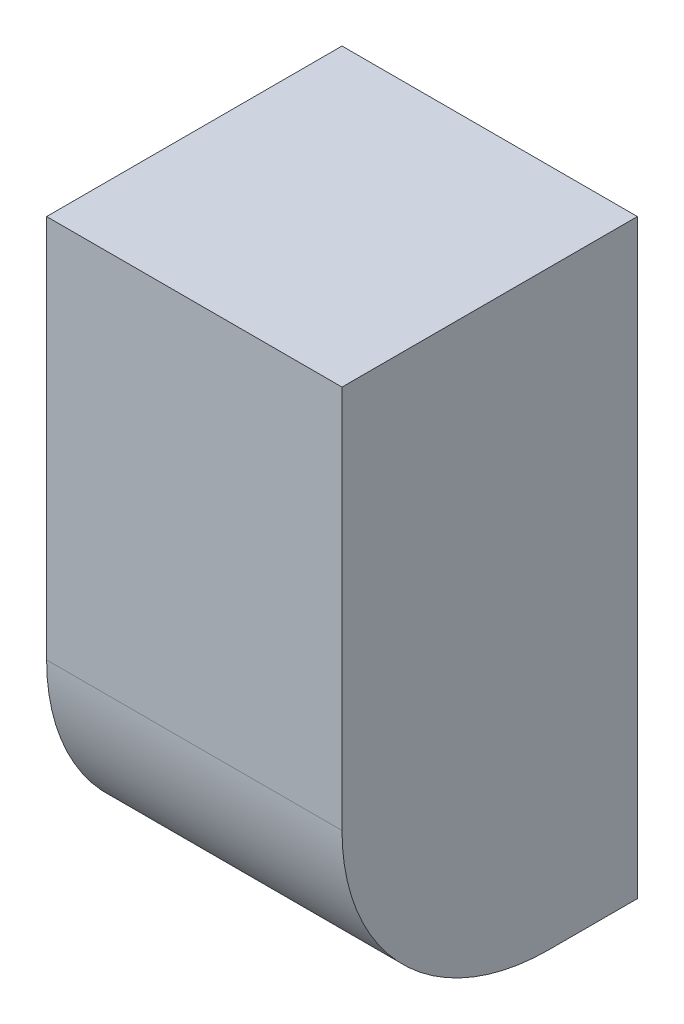
ISO-10303-21;
HEADER;
FILE_DESCRIPTION(('STEP AP214'),'2;1');
FILE_NAME('part.step','',(''),(''),'','','');
FILE_SCHEMA(('AUTOMOTIVE_DESIGN { 1 0 10303 214 1 1 1 1 }'));
ENDSEC;
DATA;
#1=APPLICATION_CONTEXT('core data for automotive mechanical design processes');
#2=APPLICATION_PROTOCOL_DEFINITION('international standard','automotive_design',2000,#1);
#3=PRODUCT_CONTEXT('',#1,'mechanical');
#4=PRODUCT('Part','Part','',(#3));
#5=PRODUCT_RELATED_PRODUCT_CATEGORY('part','',(#4));
#6=PRODUCT_DEFINITION_FORMATION('','',#4);
#7=PRODUCT_DEFINITION_CONTEXT('part definition',#1,'design');
#8=PRODUCT_DEFINITION('design','',#6,#7);
#9=PRODUCT_DEFINITION_SHAPE('','',#8);
#10=(LENGTH_UNIT() NAMED_UNIT(*) SI_UNIT(.MILLI.,.METRE.));
#11=(NAMED_UNIT(*) PLANE_ANGLE_UNIT() SI_UNIT($,.RADIAN.));
#12=(NAMED_UNIT(*) SI_UNIT($,.STERADIAN.) SOLID_ANGLE_UNIT());
#13=UNCERTAINTY_MEASURE_WITH_UNIT(LENGTH_MEASURE(1.E-05),#10,'distance_accuracy_value','');
#14=(GEOMETRIC_REPRESENTATION_CONTEXT(3) GLOBAL_UNCERTAINTY_ASSIGNED_CONTEXT((#13)) GLOBAL_UNIT_ASSIGNED_CONTEXT((#10,
#11,#12)) REPRESENTATION_CONTEXT('',''));
#15=CARTESIAN_POINT('',(0.,0.,0.));
#16=DIRECTION('',(0.,0.,1.));
#17=DIRECTION('',(1.,0.,0.));
#18=AXIS2_PLACEMENT_3D('',#15,#16,#17);
#19=CARTESIAN_POINT('',(-40.,-40.,10.));
#20=DIRECTION('',(1.,0.,0.));
#21=DIRECTION('',(0.,0.,-1.));
#22=AXIS2_PLACEMENT_3D('',#19,#20,#21);
#23=PLANE('',#22);
#24=DIRECTION('',(0.,0.,-1.));
#25=VECTOR('',#24,1.);
#26=CARTESIAN_POINT('',(-40.,-40.,10.));
#27=LINE('',#26,#25);
#28=CARTESIAN_POINT('',(-40.,-40.,3.));
#29=VERTEX_POINT('',#28);
#30=CARTESIAN_POINT('',(-40.,-40.,0.));
#31=VERTEX_POINT('',#30);
#32=EDGE_CURVE('E120',#29,#31,#27,.T.);
#33=ORIENTED_EDGE('',*,*,#32,.F.);
#34=CARTESIAN_POINT('',(-40.,-33.,3.));
#35=DIRECTION('',(1.,0.,0.));
#36=DIRECTION('',(0.,0.,-1.));
#37=AXIS2_PLACEMENT_3D('',#34,#35,#36);
#38=CIRCLE('',#37,7.);
#39=CARTESIAN_POINT('',(-40.,-33.,10.));
#40=VERTEX_POINT('',#39);
#41=EDGE_CURVE('E11',#29,#40,#38,.F.);
#42=ORIENTED_EDGE('',*,*,#41,.T.);
#43=DIRECTION('',(0.,-1.,0.));
#44=VECTOR('',#43,1.);
#45=CARTESIAN_POINT('',(-40.,-40.,10.));
#46=LINE('',#45,#44);
#47=CARTESIAN_POINT('',(-40.,-20.,10.));
#48=VERTEX_POINT('',#47);
#49=EDGE_CURVE('E91',#48,#40,#46,.T.);
#50=ORIENTED_EDGE('',*,*,#49,.F.);
#51=DIRECTION('',(0.,0.,-1.));
#52=VECTOR('',#51,1.);
#53=CARTESIAN_POINT('',(-40.,-20.,10.));
#54=LINE('',#53,#52);
#55=CARTESIAN_POINT('',(-40.,-20.,0.));
#56=VERTEX_POINT('',#55);
#57=EDGE_CURVE('E101',#48,#56,#54,.T.);
#58=ORIENTED_EDGE('',*,*,#57,.T.);
#59=DIRECTION('',(0.,-1.,0.));
#60=VECTOR('',#59,1.);
#61=CARTESIAN_POINT('',(-40.,-40.,0.));
#62=LINE('',#61,#60);
#63=EDGE_CURVE('E110',#56,#31,#62,.T.);
#64=ORIENTED_EDGE('',*,*,#63,.T.);
#65=EDGE_LOOP('',(#33,#42,#50,#58,#64));
#66=FACE_BOUND('',#65,.T.);
#67=ADVANCED_FACE('F38',(#66),#23,.F.);
#68=CARTESIAN_POINT('',(-40.,-40.,10.));
#69=DIRECTION('',(0.,1.,0.));
#70=DIRECTION('',(0.,0.,1.));
#71=AXIS2_PLACEMENT_3D('',#68,#69,#70);
#72=PLANE('',#71);
#73=DIRECTION('',(0.,0.,-1.));
#74=VECTOR('',#73,1.);
#75=CARTESIAN_POINT('',(-30.,-40.,10.));
#76=LINE('',#75,#74);
#77=CARTESIAN_POINT('',(-30.,-40.,3.));
#78=VERTEX_POINT('',#77);
#79=CARTESIAN_POINT('',(-30.,-40.,0.));
#80=VERTEX_POINT('',#79);
#81=EDGE_CURVE('E100',#78,#80,#76,.T.);
#82=ORIENTED_EDGE('',*,*,#81,.F.);
#83=DIRECTION('',(1.,0.,0.));
#84=VECTOR('',#83,1.);
#85=CARTESIAN_POINT('',(-40.,-40.,3.));
#86=LINE('',#85,#84);
#87=EDGE_CURVE('E46',#78,#29,#86,.F.);
#88=ORIENTED_EDGE('',*,*,#87,.T.);
#89=ORIENTED_EDGE('',*,*,#32,.T.);
#90=DIRECTION('',(1.,0.,0.));
#91=VECTOR('',#90,1.);
#92=CARTESIAN_POINT('',(-40.,-40.,0.));
#93=LINE('',#92,#91);
#94=EDGE_CURVE('E113',#31,#80,#93,.T.);
#95=ORIENTED_EDGE('',*,*,#94,.T.);
#96=EDGE_LOOP('',(#82,#88,#89,#95));
#97=FACE_BOUND('',#96,.T.);
#98=ADVANCED_FACE('F124',(#97),#72,.F.);
#99=CARTESIAN_POINT('',(-30.,-40.,10.));
#100=DIRECTION('',(-1.,0.,0.));
#101=DIRECTION('',(0.,0.,1.));
#102=AXIS2_PLACEMENT_3D('',#99,#100,#101);
#103=PLANE('',#102);
#104=DIRECTION('',(0.,1.,0.));
#105=VECTOR('',#104,1.);
#106=CARTESIAN_POINT('',(-30.,-40.,10.));
#107=LINE('',#106,#105);
#108=CARTESIAN_POINT('',(-30.,-33.,10.));
#109=VERTEX_POINT('',#108);
#110=CARTESIAN_POINT('',(-30.,-20.,10.));
#111=VERTEX_POINT('',#110);
#112=EDGE_CURVE('E82',#109,#111,#107,.T.);
#113=ORIENTED_EDGE('',*,*,#112,.F.);
#114=CARTESIAN_POINT('',(-30.,-33.,3.));
#115=DIRECTION('',(-1.,0.,0.));
#116=DIRECTION('',(0.,0.,1.));
#117=AXIS2_PLACEMENT_3D('',#114,#115,#116);
#118=CIRCLE('',#117,7.);
#119=EDGE_CURVE('E60',#109,#78,#118,.F.);
#120=ORIENTED_EDGE('',*,*,#119,.T.);
#121=ORIENTED_EDGE('',*,*,#81,.T.);
#122=DIRECTION('',(0.,1.,0.));
#123=VECTOR('',#122,1.);
#124=CARTESIAN_POINT('',(-30.,-40.,0.));
#125=LINE('',#124,#123);
#126=CARTESIAN_POINT('',(-30.,-20.,0.));
#127=VERTEX_POINT('',#126);
#128=EDGE_CURVE('E97',#80,#127,#125,.T.);
#129=ORIENTED_EDGE('',*,*,#128,.T.);
#130=DIRECTION('',(0.,0.,-1.));
#131=VECTOR('',#130,1.);
#132=CARTESIAN_POINT('',(-30.,-20.,10.));
#133=LINE('',#132,#131);
#134=EDGE_CURVE('E94',#111,#127,#133,.T.);
#135=ORIENTED_EDGE('',*,*,#134,.F.);
#136=EDGE_LOOP('',(#113,#120,#121,#129,#135));
#137=FACE_BOUND('',#136,.T.);
#138=ADVANCED_FACE('F95',(#137),#103,.F.);
#139=CARTESIAN_POINT('',(-40.,-20.,10.));
#140=DIRECTION('',(0.,-1.,0.));
#141=DIRECTION('',(0.,0.,-1.));
#142=AXIS2_PLACEMENT_3D('',#139,#140,#141);
#143=PLANE('',#142);
#144=DIRECTION('',(-1.,0.,0.));
#145=VECTOR('',#144,1.);
#146=CARTESIAN_POINT('',(-40.,-20.,0.));
#147=LINE('',#146,#145);
#148=EDGE_CURVE('E117',#127,#56,#147,.T.);
#149=ORIENTED_EDGE('',*,*,#148,.T.);
#150=ORIENTED_EDGE('',*,*,#57,.F.);
#151=DIRECTION('',(-1.,0.,0.));
#152=VECTOR('',#151,1.);
#153=CARTESIAN_POINT('',(-40.,-20.,10.));
#154=LINE('',#153,#152);
#155=EDGE_CURVE('E87',#111,#48,#154,.T.);
#156=ORIENTED_EDGE('',*,*,#155,.F.);
#157=ORIENTED_EDGE('',*,*,#134,.T.);
#158=EDGE_LOOP('',(#149,#150,#156,#157));
#159=FACE_BOUND('',#158,.T.);
#160=ADVANCED_FACE('F103',(#159),#143,.F.);
#161=CARTESIAN_POINT('',(0.,0.,10.));
#162=DIRECTION('',(0.,0.,-1.));
#163=DIRECTION('',(-1.,0.,0.));
#164=AXIS2_PLACEMENT_3D('',#161,#162,#163);
#165=PLANE('',#164);
#166=ORIENTED_EDGE('',*,*,#49,.T.);
#167=DIRECTION('',(1.,0.,0.));
#168=VECTOR('',#167,1.);
#169=CARTESIAN_POINT('',(0.,-33.,10.));
#170=LINE('',#169,#168);
#171=EDGE_CURVE('E90',#40,#109,#170,.T.);
#172=ORIENTED_EDGE('',*,*,#171,.T.);
#173=ORIENTED_EDGE('',*,*,#112,.T.);
#174=ORIENTED_EDGE('',*,*,#155,.T.);
#175=EDGE_LOOP('',(#166,#172,#173,#174));
#176=FACE_BOUND('',#175,.T.);
#177=ADVANCED_FACE('F85',(#176),#165,.F.);
#178=CARTESIAN_POINT('',(0.,0.,0.));
#179=DIRECTION('',(0.,0.,-1.));
#180=DIRECTION('',(-1.,0.,0.));
#181=AXIS2_PLACEMENT_3D('',#178,#179,#180);
#182=PLANE('',#181);
#183=ORIENTED_EDGE('',*,*,#63,.F.);
#184=ORIENTED_EDGE('',*,*,#148,.F.);
#185=ORIENTED_EDGE('',*,*,#128,.F.);
#186=ORIENTED_EDGE('',*,*,#94,.F.);
#187=EDGE_LOOP('',(#183,#184,#185,#186));
#188=FACE_BOUND('',#187,.T.);
#189=ADVANCED_FACE('F129',(#188),#182,.T.);
#190=CARTESIAN_POINT('',(0.,-33.,3.));
#191=DIRECTION('',(1.,0.,0.));
#192=DIRECTION('',(0.,0.,-1.));
#193=AXIS2_PLACEMENT_3D('',#190,#191,#192);
#194=CYLINDRICAL_SURFACE('',#193,7.);
#195=ORIENTED_EDGE('',*,*,#41,.F.);
#196=ORIENTED_EDGE('',*,*,#87,.F.);
#197=ORIENTED_EDGE('',*,*,#119,.F.);
#198=ORIENTED_EDGE('',*,*,#171,.F.);
#199=EDGE_LOOP('',(#195,#196,#197,#198));
#200=FACE_BOUND('',#199,.T.);
#201=ADVANCED_FACE('F40',(#200),#194,.T.);
#202=CLOSED_SHELL('',(#67,#98,#138,#160,#177,#189,#201));
#203=MANIFOLD_SOLID_BREP('B2',#202);
#204=ADVANCED_BREP_SHAPE_REPRESENTATION('',(#18,#203),#14);
#205=SHAPE_DEFINITION_REPRESENTATION(#9,#204);
ENDSEC;
END-ISO-10303-21;
